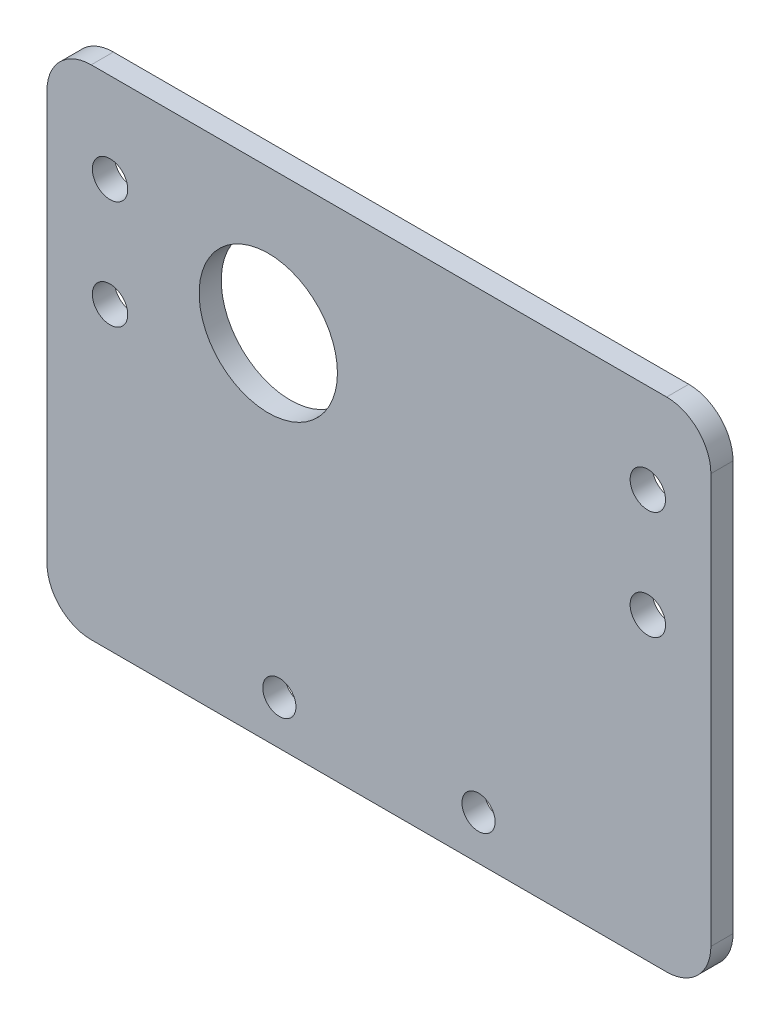
ISO-10303-21;
HEADER;
FILE_DESCRIPTION(('STEP AP214'),'2;1');
FILE_NAME('part.step','',(''),(''),'','','');
FILE_SCHEMA(('AUTOMOTIVE_DESIGN { 1 0 10303 214 1 1 1 1 }'));
ENDSEC;
DATA;
#1=APPLICATION_CONTEXT('core data for automotive mechanical design processes');
#2=APPLICATION_PROTOCOL_DEFINITION('international standard','automotive_design',2000,#1);
#3=PRODUCT_CONTEXT('',#1,'mechanical');
#4=PRODUCT('Part','Part','',(#3));
#5=PRODUCT_RELATED_PRODUCT_CATEGORY('part','',(#4));
#6=PRODUCT_DEFINITION_FORMATION('','',#4);
#7=PRODUCT_DEFINITION_CONTEXT('part definition',#1,'design');
#8=PRODUCT_DEFINITION('design','',#6,#7);
#9=PRODUCT_DEFINITION_SHAPE('','',#8);
#10=(LENGTH_UNIT() NAMED_UNIT(*) SI_UNIT(.MILLI.,.METRE.));
#11=(NAMED_UNIT(*) PLANE_ANGLE_UNIT() SI_UNIT($,.RADIAN.));
#12=(NAMED_UNIT(*) SI_UNIT($,.STERADIAN.) SOLID_ANGLE_UNIT());
#13=UNCERTAINTY_MEASURE_WITH_UNIT(LENGTH_MEASURE(1.E-05),#10,'distance_accuracy_value','');
#14=(GEOMETRIC_REPRESENTATION_CONTEXT(3) GLOBAL_UNCERTAINTY_ASSIGNED_CONTEXT((#13)) GLOBAL_UNIT_ASSIGNED_CONTEXT((#10,
#11,#12)) REPRESENTATION_CONTEXT('',''));
#15=CARTESIAN_POINT('',(0.,0.,0.));
#16=DIRECTION('',(0.,0.,1.));
#17=DIRECTION('',(1.,0.,0.));
#18=AXIS2_PLACEMENT_3D('',#15,#16,#17);
#19=CARTESIAN_POINT('',(0.,0.,2.));
#20=DIRECTION('',(1.,0.,0.));
#21=DIRECTION('',(0.,0.,-1.));
#22=AXIS2_PLACEMENT_3D('',#19,#20,#21);
#23=PLANE('',#22);
#24=DIRECTION('',(0.,-1.,0.));
#25=VECTOR('',#24,1.);
#26=CARTESIAN_POINT('',(0.,0.,0.));
#27=LINE('',#26,#25);
#28=CARTESIAN_POINT('',(0.,41.,0.));
#29=VERTEX_POINT('',#28);
#30=CARTESIAN_POINT('',(0.,4.,0.));
#31=VERTEX_POINT('',#30);
#32=EDGE_CURVE('E159',#29,#31,#27,.T.);
#33=ORIENTED_EDGE('',*,*,#32,.T.);
#34=DIRECTION('',(0.,0.,-1.));
#35=VECTOR('',#34,1.);
#36=CARTESIAN_POINT('',(0.,4.,2.));
#37=LINE('',#36,#35);
#38=CARTESIAN_POINT('',(0.,4.,2.));
#39=VERTEX_POINT('',#38);
#40=EDGE_CURVE('E11',#31,#39,#37,.F.);
#41=ORIENTED_EDGE('',*,*,#40,.T.);
#42=DIRECTION('',(0.,-1.,0.));
#43=VECTOR('',#42,1.);
#44=CARTESIAN_POINT('',(0.,0.,2.));
#45=LINE('',#44,#43);
#46=CARTESIAN_POINT('',(0.,41.,2.));
#47=VERTEX_POINT('',#46);
#48=EDGE_CURVE('E127',#47,#39,#45,.T.);
#49=ORIENTED_EDGE('',*,*,#48,.F.);
#50=DIRECTION('',(0.,0.,-1.));
#51=VECTOR('',#50,1.);
#52=CARTESIAN_POINT('',(0.,41.,2.));
#53=LINE('',#52,#51);
#54=EDGE_CURVE('E43',#47,#29,#53,.T.);
#55=ORIENTED_EDGE('',*,*,#54,.T.);
#56=EDGE_LOOP('',(#33,#41,#49,#55));
#57=FACE_BOUND('',#56,.T.);
#58=ADVANCED_FACE('F35',(#57),#23,.F.);
#59=CARTESIAN_POINT('',(0.,0.,2.));
#60=DIRECTION('',(0.,1.,0.));
#61=DIRECTION('',(0.,0.,1.));
#62=AXIS2_PLACEMENT_3D('',#59,#60,#61);
#63=PLANE('',#62);
#64=DIRECTION('',(1.,0.,0.));
#65=VECTOR('',#64,1.);
#66=CARTESIAN_POINT('',(0.,0.,0.));
#67=LINE('',#66,#65);
#68=CARTESIAN_POINT('',(4.,0.,0.));
#69=VERTEX_POINT('',#68);
#70=CARTESIAN_POINT('',(56.,0.,0.));
#71=VERTEX_POINT('',#70);
#72=EDGE_CURVE('E132',#69,#71,#67,.T.);
#73=ORIENTED_EDGE('',*,*,#72,.T.);
#74=DIRECTION('',(0.,0.,-1.));
#75=VECTOR('',#74,1.);
#76=CARTESIAN_POINT('',(56.,0.,2.));
#77=LINE('',#76,#75);
#78=CARTESIAN_POINT('',(56.,0.,2.));
#79=VERTEX_POINT('',#78);
#80=EDGE_CURVE('E50',#71,#79,#77,.F.);
#81=ORIENTED_EDGE('',*,*,#80,.T.);
#82=DIRECTION('',(1.,0.,0.));
#83=VECTOR('',#82,1.);
#84=CARTESIAN_POINT('',(0.,0.,2.));
#85=LINE('',#84,#83);
#86=CARTESIAN_POINT('',(4.,0.,2.));
#87=VERTEX_POINT('',#86);
#88=EDGE_CURVE('E130',#87,#79,#85,.T.);
#89=ORIENTED_EDGE('',*,*,#88,.F.);
#90=DIRECTION('',(0.,0.,-1.));
#91=VECTOR('',#90,1.);
#92=CARTESIAN_POINT('',(4.,0.,2.));
#93=LINE('',#92,#91);
#94=EDGE_CURVE('E151',#87,#69,#93,.T.);
#95=ORIENTED_EDGE('',*,*,#94,.T.);
#96=EDGE_LOOP('',(#73,#81,#89,#95));
#97=FACE_BOUND('',#96,.T.);
#98=ADVANCED_FACE('F245',(#97),#63,.F.);
#99=CARTESIAN_POINT('',(60.,0.,2.));
#100=DIRECTION('',(-1.,0.,0.));
#101=DIRECTION('',(0.,0.,1.));
#102=AXIS2_PLACEMENT_3D('',#99,#100,#101);
#103=PLANE('',#102);
#104=DIRECTION('',(0.,1.,0.));
#105=VECTOR('',#104,1.);
#106=CARTESIAN_POINT('',(60.,0.,0.));
#107=LINE('',#106,#105);
#108=CARTESIAN_POINT('',(60.,4.,0.));
#109=VERTEX_POINT('',#108);
#110=CARTESIAN_POINT('',(60.,41.,0.));
#111=VERTEX_POINT('',#110);
#112=EDGE_CURVE('E128',#109,#111,#107,.T.);
#113=ORIENTED_EDGE('',*,*,#112,.T.);
#114=DIRECTION('',(0.,0.,-1.));
#115=VECTOR('',#114,1.);
#116=CARTESIAN_POINT('',(60.,41.,2.));
#117=LINE('',#116,#115);
#118=CARTESIAN_POINT('',(60.,41.,2.));
#119=VERTEX_POINT('',#118);
#120=EDGE_CURVE('E106',#111,#119,#117,.F.);
#121=ORIENTED_EDGE('',*,*,#120,.T.);
#122=DIRECTION('',(0.,1.,0.));
#123=VECTOR('',#122,1.);
#124=CARTESIAN_POINT('',(60.,0.,2.));
#125=LINE('',#124,#123);
#126=CARTESIAN_POINT('',(60.,4.,2.));
#127=VERTEX_POINT('',#126);
#128=EDGE_CURVE('E171',#127,#119,#125,.T.);
#129=ORIENTED_EDGE('',*,*,#128,.F.);
#130=DIRECTION('',(0.,0.,-1.));
#131=VECTOR('',#130,1.);
#132=CARTESIAN_POINT('',(60.,4.,2.));
#133=LINE('',#132,#131);
#134=EDGE_CURVE('E111',#127,#109,#133,.T.);
#135=ORIENTED_EDGE('',*,*,#134,.T.);
#136=EDGE_LOOP('',(#113,#121,#129,#135));
#137=FACE_BOUND('',#136,.T.);
#138=ADVANCED_FACE('F242',(#137),#103,.F.);
#139=CARTESIAN_POINT('',(0.,45.,2.));
#140=DIRECTION('',(0.,-1.,0.));
#141=DIRECTION('',(0.,0.,-1.));
#142=AXIS2_PLACEMENT_3D('',#139,#140,#141);
#143=PLANE('',#142);
#144=DIRECTION('',(-1.,0.,0.));
#145=VECTOR('',#144,1.);
#146=CARTESIAN_POINT('',(0.,45.,2.));
#147=LINE('',#146,#145);
#148=CARTESIAN_POINT('',(56.,45.,2.));
#149=VERTEX_POINT('',#148);
#150=CARTESIAN_POINT('',(4.,45.,2.));
#151=VERTEX_POINT('',#150);
#152=EDGE_CURVE('E121',#149,#151,#147,.T.);
#153=ORIENTED_EDGE('',*,*,#152,.F.);
#154=DIRECTION('',(0.,0.,-1.));
#155=VECTOR('',#154,1.);
#156=CARTESIAN_POINT('',(56.,45.,2.));
#157=LINE('',#156,#155);
#158=CARTESIAN_POINT('',(56.,45.,0.));
#159=VERTEX_POINT('',#158);
#160=EDGE_CURVE('E105',#149,#159,#157,.T.);
#161=ORIENTED_EDGE('',*,*,#160,.T.);
#162=DIRECTION('',(-1.,0.,0.));
#163=VECTOR('',#162,1.);
#164=CARTESIAN_POINT('',(0.,45.,0.));
#165=LINE('',#164,#163);
#166=CARTESIAN_POINT('',(4.,45.,0.));
#167=VERTEX_POINT('',#166);
#168=EDGE_CURVE('E118',#159,#167,#165,.T.);
#169=ORIENTED_EDGE('',*,*,#168,.T.);
#170=DIRECTION('',(0.,0.,-1.));
#171=VECTOR('',#170,1.);
#172=CARTESIAN_POINT('',(4.,45.,2.));
#173=LINE('',#172,#171);
#174=EDGE_CURVE('E123',#167,#151,#173,.F.);
#175=ORIENTED_EDGE('',*,*,#174,.T.);
#176=EDGE_LOOP('',(#153,#161,#169,#175));
#177=FACE_BOUND('',#176,.T.);
#178=ADVANCED_FACE('F117',(#177),#143,.F.);
#179=CARTESIAN_POINT('',(0.,0.,2.));
#180=DIRECTION('',(0.,0.,-1.));
#181=DIRECTION('',(-1.,0.,0.));
#182=AXIS2_PLACEMENT_3D('',#179,#180,#181);
#183=PLANE('',#182);
#184=CARTESIAN_POINT('',(20.,32.,2.));
#185=DIRECTION('',(0.,0.,1.));
#186=DIRECTION('',(1.,0.,0.));
#187=AXIS2_PLACEMENT_3D('',#184,#185,#186);
#188=CIRCLE('',#187,6.25);
#189=CARTESIAN_POINT('',(26.25,32.,2.));
#190=VERTEX_POINT('',#189);
#191=EDGE_CURVE('E208',#190,#190,#188,.T.);
#192=ORIENTED_EDGE('',*,*,#191,.F.);
#193=EDGE_LOOP('',(#192));
#194=FACE_BOUND('',#193,.T.);
#195=CARTESIAN_POINT('',(5.7,27.1,2.));
#196=DIRECTION('',(0.,0.,1.));
#197=DIRECTION('',(1.,0.,0.));
#198=AXIS2_PLACEMENT_3D('',#195,#196,#197);
#199=CIRCLE('',#198,1.6);
#200=CARTESIAN_POINT('',(7.3,27.1,2.));
#201=VERTEX_POINT('',#200);
#202=EDGE_CURVE('E197',#201,#201,#199,.T.);
#203=ORIENTED_EDGE('',*,*,#202,.F.);
#204=EDGE_LOOP('',(#203));
#205=FACE_BOUND('',#204,.T.);
#206=CARTESIAN_POINT('',(54.3,36.9,2.));
#207=DIRECTION('',(0.,0.,1.));
#208=DIRECTION('',(1.,0.,0.));
#209=AXIS2_PLACEMENT_3D('',#206,#207,#208);
#210=CIRCLE('',#209,1.6);
#211=CARTESIAN_POINT('',(55.9,36.9,2.));
#212=VERTEX_POINT('',#211);
#213=EDGE_CURVE('E190',#212,#212,#210,.T.);
#214=ORIENTED_EDGE('',*,*,#213,.F.);
#215=EDGE_LOOP('',(#214));
#216=FACE_BOUND('',#215,.T.);
#217=CARTESIAN_POINT('',(54.3,27.1,2.));
#218=DIRECTION('',(0.,0.,1.));
#219=DIRECTION('',(1.,0.,0.));
#220=AXIS2_PLACEMENT_3D('',#217,#218,#219);
#221=CIRCLE('',#220,1.6);
#222=CARTESIAN_POINT('',(55.9,27.1,2.));
#223=VERTEX_POINT('',#222);
#224=EDGE_CURVE('E202',#223,#223,#221,.T.);
#225=ORIENTED_EDGE('',*,*,#224,.F.);
#226=EDGE_LOOP('',(#225));
#227=FACE_BOUND('',#226,.T.);
#228=CARTESIAN_POINT('',(5.7,36.9,2.));
#229=DIRECTION('',(0.,0.,1.));
#230=DIRECTION('',(1.,0.,0.));
#231=AXIS2_PLACEMENT_3D('',#228,#229,#230);
#232=CIRCLE('',#231,1.6);
#233=CARTESIAN_POINT('',(7.29999999999999,36.9,2.));
#234=VERTEX_POINT('',#233);
#235=EDGE_CURVE('E184',#234,#234,#232,.T.);
#236=ORIENTED_EDGE('',*,*,#235,.F.);
#237=EDGE_LOOP('',(#236));
#238=FACE_BOUND('',#237,.T.);
#239=CARTESIAN_POINT('',(39.,3.99999999999999,2.));
#240=DIRECTION('',(0.,0.,-1.));
#241=DIRECTION('',(-1.,0.,0.));
#242=AXIS2_PLACEMENT_3D('',#239,#240,#241);
#243=CIRCLE('',#242,1.5);
#244=CARTESIAN_POINT('',(37.5,3.99999999999999,2.));
#245=VERTEX_POINT('',#244);
#246=EDGE_CURVE('E164',#245,#245,#243,.T.);
#247=ORIENTED_EDGE('',*,*,#246,.T.);
#248=EDGE_LOOP('',(#247));
#249=FACE_BOUND('',#248,.T.);
#250=CARTESIAN_POINT('',(21.,3.99999999999999,2.));
#251=DIRECTION('',(0.,0.,-1.));
#252=DIRECTION('',(-1.,0.,0.));
#253=AXIS2_PLACEMENT_3D('',#250,#251,#252);
#254=CIRCLE('',#253,1.5);
#255=CARTESIAN_POINT('',(19.5,3.99999999999999,2.));
#256=VERTEX_POINT('',#255);
#257=EDGE_CURVE('E178',#256,#256,#254,.T.);
#258=ORIENTED_EDGE('',*,*,#257,.T.);
#259=EDGE_LOOP('',(#258));
#260=FACE_BOUND('',#259,.T.);
#261=ORIENTED_EDGE('',*,*,#128,.T.);
#262=CARTESIAN_POINT('',(56.,41.,2.));
#263=DIRECTION('',(0.,0.,-1.));
#264=DIRECTION('',(-1.,0.,0.));
#265=AXIS2_PLACEMENT_3D('',#262,#263,#264);
#266=CIRCLE('',#265,4.);
#267=EDGE_CURVE('E149',#119,#149,#266,.F.);
#268=ORIENTED_EDGE('',*,*,#267,.T.);
#269=ORIENTED_EDGE('',*,*,#152,.T.);
#270=CARTESIAN_POINT('',(4.,41.,2.));
#271=DIRECTION('',(0.,0.,-1.));
#272=DIRECTION('',(-1.,0.,0.));
#273=AXIS2_PLACEMENT_3D('',#270,#271,#272);
#274=CIRCLE('',#273,4.);
#275=EDGE_CURVE('E144',#151,#47,#274,.F.);
#276=ORIENTED_EDGE('',*,*,#275,.T.);
#277=ORIENTED_EDGE('',*,*,#48,.T.);
#278=CARTESIAN_POINT('',(4.,4.,2.));
#279=DIRECTION('',(0.,0.,-1.));
#280=DIRECTION('',(-1.,0.,0.));
#281=AXIS2_PLACEMENT_3D('',#278,#279,#280);
#282=CIRCLE('',#281,4.);
#283=EDGE_CURVE('E57',#39,#87,#282,.F.);
#284=ORIENTED_EDGE('',*,*,#283,.T.);
#285=ORIENTED_EDGE('',*,*,#88,.T.);
#286=CARTESIAN_POINT('',(56.,4.,2.));
#287=DIRECTION('',(0.,0.,-1.));
#288=DIRECTION('',(-1.,0.,0.));
#289=AXIS2_PLACEMENT_3D('',#286,#287,#288);
#290=CIRCLE('',#289,4.);
#291=EDGE_CURVE('E147',#79,#127,#290,.F.);
#292=ORIENTED_EDGE('',*,*,#291,.T.);
#293=EDGE_LOOP('',(#261,#268,#269,#276,#277,#284,#285,#292));
#294=FACE_BOUND('',#293,.T.);
#295=ADVANCED_FACE('F223',(#194,#205,#216,#227,#238,#249,#260,#294),#183,.F.);
#296=CARTESIAN_POINT('',(0.,0.,0.));
#297=DIRECTION('',(0.,0.,-1.));
#298=DIRECTION('',(-1.,0.,0.));
#299=AXIS2_PLACEMENT_3D('',#296,#297,#298);
#300=PLANE('',#299);
#301=CARTESIAN_POINT('',(20.,32.,0.));
#302=DIRECTION('',(0.,0.,1.));
#303=DIRECTION('',(1.,0.,0.));
#304=AXIS2_PLACEMENT_3D('',#301,#302,#303);
#305=CIRCLE('',#304,6.25);
#306=CARTESIAN_POINT('',(26.25,32.,0.));
#307=VERTEX_POINT('',#306);
#308=EDGE_CURVE('E205',#307,#307,#305,.T.);
#309=ORIENTED_EDGE('',*,*,#308,.T.);
#310=EDGE_LOOP('',(#309));
#311=FACE_BOUND('',#310,.T.);
#312=CARTESIAN_POINT('',(5.7,27.1,0.));
#313=DIRECTION('',(0.,0.,1.));
#314=DIRECTION('',(1.,0.,0.));
#315=AXIS2_PLACEMENT_3D('',#312,#313,#314);
#316=CIRCLE('',#315,1.6);
#317=CARTESIAN_POINT('',(7.3,27.1,0.));
#318=VERTEX_POINT('',#317);
#319=EDGE_CURVE('E187',#318,#318,#316,.T.);
#320=ORIENTED_EDGE('',*,*,#319,.T.);
#321=EDGE_LOOP('',(#320));
#322=FACE_BOUND('',#321,.T.);
#323=CARTESIAN_POINT('',(54.3,36.9,0.));
#324=DIRECTION('',(0.,0.,1.));
#325=DIRECTION('',(1.,0.,0.));
#326=AXIS2_PLACEMENT_3D('',#323,#324,#325);
#327=CIRCLE('',#326,1.6);
#328=CARTESIAN_POINT('',(55.9,36.9,0.));
#329=VERTEX_POINT('',#328);
#330=EDGE_CURVE('E193',#329,#329,#327,.T.);
#331=ORIENTED_EDGE('',*,*,#330,.T.);
#332=EDGE_LOOP('',(#331));
#333=FACE_BOUND('',#332,.T.);
#334=CARTESIAN_POINT('',(54.3,27.1,0.));
#335=DIRECTION('',(0.,0.,1.));
#336=DIRECTION('',(1.,0.,0.));
#337=AXIS2_PLACEMENT_3D('',#334,#335,#336);
#338=CIRCLE('',#337,1.6);
#339=CARTESIAN_POINT('',(55.9,27.1,0.));
#340=VERTEX_POINT('',#339);
#341=EDGE_CURVE('E194',#340,#340,#338,.T.);
#342=ORIENTED_EDGE('',*,*,#341,.T.);
#343=EDGE_LOOP('',(#342));
#344=FACE_BOUND('',#343,.T.);
#345=CARTESIAN_POINT('',(5.7,36.9,0.));
#346=DIRECTION('',(0.,0.,1.));
#347=DIRECTION('',(1.,0.,0.));
#348=AXIS2_PLACEMENT_3D('',#345,#346,#347);
#349=CIRCLE('',#348,1.6);
#350=CARTESIAN_POINT('',(7.29999999999999,36.9,0.));
#351=VERTEX_POINT('',#350);
#352=EDGE_CURVE('E179',#351,#351,#349,.T.);
#353=ORIENTED_EDGE('',*,*,#352,.T.);
#354=EDGE_LOOP('',(#353));
#355=FACE_BOUND('',#354,.T.);
#356=CARTESIAN_POINT('',(39.,3.99999999999999,0.));
#357=DIRECTION('',(0.,0.,-1.));
#358=DIRECTION('',(-1.,0.,0.));
#359=AXIS2_PLACEMENT_3D('',#356,#357,#358);
#360=CIRCLE('',#359,1.5);
#361=CARTESIAN_POINT('',(37.5,3.99999999999999,0.));
#362=VERTEX_POINT('',#361);
#363=EDGE_CURVE('E167',#362,#362,#360,.T.);
#364=ORIENTED_EDGE('',*,*,#363,.F.);
#365=EDGE_LOOP('',(#364));
#366=FACE_BOUND('',#365,.T.);
#367=CARTESIAN_POINT('',(21.,3.99999999999999,0.));
#368=DIRECTION('',(0.,0.,-1.));
#369=DIRECTION('',(-1.,0.,0.));
#370=AXIS2_PLACEMENT_3D('',#367,#368,#369);
#371=CIRCLE('',#370,1.5);
#372=CARTESIAN_POINT('',(19.5,3.99999999999999,0.));
#373=VERTEX_POINT('',#372);
#374=EDGE_CURVE('E175',#373,#373,#371,.T.);
#375=ORIENTED_EDGE('',*,*,#374,.F.);
#376=EDGE_LOOP('',(#375));
#377=FACE_BOUND('',#376,.T.);
#378=ORIENTED_EDGE('',*,*,#168,.F.);
#379=CARTESIAN_POINT('',(56.,41.,0.));
#380=DIRECTION('',(0.,0.,-1.));
#381=DIRECTION('',(-1.,0.,0.));
#382=AXIS2_PLACEMENT_3D('',#379,#380,#381);
#383=CIRCLE('',#382,4.);
#384=EDGE_CURVE('E101',#159,#111,#383,.T.);
#385=ORIENTED_EDGE('',*,*,#384,.T.);
#386=ORIENTED_EDGE('',*,*,#112,.F.);
#387=CARTESIAN_POINT('',(56.,4.,0.));
#388=DIRECTION('',(0.,0.,-1.));
#389=DIRECTION('',(-1.,0.,0.));
#390=AXIS2_PLACEMENT_3D('',#387,#388,#389);
#391=CIRCLE('',#390,4.);
#392=EDGE_CURVE('E112',#109,#71,#391,.T.);
#393=ORIENTED_EDGE('',*,*,#392,.T.);
#394=ORIENTED_EDGE('',*,*,#72,.F.);
#395=CARTESIAN_POINT('',(4.,4.,0.));
#396=DIRECTION('',(0.,0.,-1.));
#397=DIRECTION('',(-1.,0.,0.));
#398=AXIS2_PLACEMENT_3D('',#395,#396,#397);
#399=CIRCLE('',#398,4.);
#400=EDGE_CURVE('E138',#69,#31,#399,.T.);
#401=ORIENTED_EDGE('',*,*,#400,.T.);
#402=ORIENTED_EDGE('',*,*,#32,.F.);
#403=CARTESIAN_POINT('',(4.,41.,0.));
#404=DIRECTION('',(0.,0.,-1.));
#405=DIRECTION('',(-1.,0.,0.));
#406=AXIS2_PLACEMENT_3D('',#403,#404,#405);
#407=CIRCLE('',#406,4.);
#408=EDGE_CURVE('E122',#29,#167,#407,.T.);
#409=ORIENTED_EDGE('',*,*,#408,.T.);
#410=EDGE_LOOP('',(#378,#385,#386,#393,#394,#401,#402,#409));
#411=FACE_BOUND('',#410,.T.);
#412=ADVANCED_FACE('F125',(#311,#322,#333,#344,#355,#366,#377,#411),#300,.T.);
#413=CARTESIAN_POINT('',(56.,41.,2.));
#414=DIRECTION('',(0.,0.,-1.));
#415=DIRECTION('',(-1.,0.,0.));
#416=AXIS2_PLACEMENT_3D('',#413,#414,#415);
#417=CYLINDRICAL_SURFACE('',#416,4.);
#418=ORIENTED_EDGE('',*,*,#267,.F.);
#419=ORIENTED_EDGE('',*,*,#120,.F.);
#420=ORIENTED_EDGE('',*,*,#384,.F.);
#421=ORIENTED_EDGE('',*,*,#160,.F.);
#422=EDGE_LOOP('',(#418,#419,#420,#421));
#423=FACE_BOUND('',#422,.T.);
#424=ADVANCED_FACE('F104',(#423),#417,.T.);
#425=CARTESIAN_POINT('',(56.,4.,2.));
#426=DIRECTION('',(0.,0.,-1.));
#427=DIRECTION('',(-1.,0.,0.));
#428=AXIS2_PLACEMENT_3D('',#425,#426,#427);
#429=CYLINDRICAL_SURFACE('',#428,4.);
#430=ORIENTED_EDGE('',*,*,#291,.F.);
#431=ORIENTED_EDGE('',*,*,#80,.F.);
#432=ORIENTED_EDGE('',*,*,#392,.F.);
#433=ORIENTED_EDGE('',*,*,#134,.F.);
#434=EDGE_LOOP('',(#430,#431,#432,#433));
#435=FACE_BOUND('',#434,.T.);
#436=ADVANCED_FACE('F244',(#435),#429,.T.);
#437=CARTESIAN_POINT('',(4.,4.,2.));
#438=DIRECTION('',(0.,0.,-1.));
#439=DIRECTION('',(-1.,0.,0.));
#440=AXIS2_PLACEMENT_3D('',#437,#438,#439);
#441=CYLINDRICAL_SURFACE('',#440,4.);
#442=ORIENTED_EDGE('',*,*,#283,.F.);
#443=ORIENTED_EDGE('',*,*,#40,.F.);
#444=ORIENTED_EDGE('',*,*,#400,.F.);
#445=ORIENTED_EDGE('',*,*,#94,.F.);
#446=EDGE_LOOP('',(#442,#443,#444,#445));
#447=FACE_BOUND('',#446,.T.);
#448=ADVANCED_FACE('F248',(#447),#441,.T.);
#449=CARTESIAN_POINT('',(4.,41.,2.));
#450=DIRECTION('',(0.,0.,-1.));
#451=DIRECTION('',(-1.,0.,0.));
#452=AXIS2_PLACEMENT_3D('',#449,#450,#451);
#453=CYLINDRICAL_SURFACE('',#452,4.);
#454=ORIENTED_EDGE('',*,*,#275,.F.);
#455=ORIENTED_EDGE('',*,*,#174,.F.);
#456=ORIENTED_EDGE('',*,*,#408,.F.);
#457=ORIENTED_EDGE('',*,*,#54,.F.);
#458=EDGE_LOOP('',(#454,#455,#456,#457));
#459=FACE_BOUND('',#458,.T.);
#460=ADVANCED_FACE('F37',(#459),#453,.T.);
#461=CARTESIAN_POINT('',(21.,3.99999999999999,2.));
#462=DIRECTION('',(0.,0.,-1.));
#463=DIRECTION('',(-1.,0.,0.));
#464=AXIS2_PLACEMENT_3D('',#461,#462,#463);
#465=CYLINDRICAL_SURFACE('',#464,1.5);
#466=ORIENTED_EDGE('',*,*,#257,.F.);
#467=EDGE_LOOP('',(#466));
#468=FACE_BOUND('',#467,.T.);
#469=ORIENTED_EDGE('',*,*,#374,.T.);
#470=EDGE_LOOP('',(#469));
#471=FACE_BOUND('',#470,.T.);
#472=ADVANCED_FACE('F250',(#468,#471),#465,.F.);
#473=CARTESIAN_POINT('',(39.,3.99999999999999,2.));
#474=DIRECTION('',(0.,0.,-1.));
#475=DIRECTION('',(-1.,0.,0.));
#476=AXIS2_PLACEMENT_3D('',#473,#474,#475);
#477=CYLINDRICAL_SURFACE('',#476,1.5);
#478=ORIENTED_EDGE('',*,*,#246,.F.);
#479=EDGE_LOOP('',(#478));
#480=FACE_BOUND('',#479,.T.);
#481=ORIENTED_EDGE('',*,*,#363,.T.);
#482=EDGE_LOOP('',(#481));
#483=FACE_BOUND('',#482,.T.);
#484=ADVANCED_FACE('F255',(#480,#483),#477,.F.);
#485=CARTESIAN_POINT('',(5.7,36.9,0.));
#486=DIRECTION('',(0.,0.,1.));
#487=DIRECTION('',(1.,0.,0.));
#488=AXIS2_PLACEMENT_3D('',#485,#486,#487);
#489=CYLINDRICAL_SURFACE('',#488,1.6);
#490=ORIENTED_EDGE('',*,*,#352,.F.);
#491=EDGE_LOOP('',(#490));
#492=FACE_BOUND('',#491,.T.);
#493=ORIENTED_EDGE('',*,*,#235,.T.);
#494=EDGE_LOOP('',(#493));
#495=FACE_BOUND('',#494,.T.);
#496=ADVANCED_FACE('F297',(#492,#495),#489,.F.);
#497=CARTESIAN_POINT('',(54.3,27.1,0.));
#498=DIRECTION('',(0.,0.,1.));
#499=DIRECTION('',(1.,0.,0.));
#500=AXIS2_PLACEMENT_3D('',#497,#498,#499);
#501=CYLINDRICAL_SURFACE('',#500,1.6);
#502=ORIENTED_EDGE('',*,*,#341,.F.);
#503=EDGE_LOOP('',(#502));
#504=FACE_BOUND('',#503,.T.);
#505=ORIENTED_EDGE('',*,*,#224,.T.);
#506=EDGE_LOOP('',(#505));
#507=FACE_BOUND('',#506,.T.);
#508=ADVANCED_FACE('F307',(#504,#507),#501,.F.);
#509=CARTESIAN_POINT('',(54.3,36.9,0.));
#510=DIRECTION('',(0.,0.,1.));
#511=DIRECTION('',(1.,0.,0.));
#512=AXIS2_PLACEMENT_3D('',#509,#510,#511);
#513=CYLINDRICAL_SURFACE('',#512,1.6);
#514=ORIENTED_EDGE('',*,*,#330,.F.);
#515=EDGE_LOOP('',(#514));
#516=FACE_BOUND('',#515,.T.);
#517=ORIENTED_EDGE('',*,*,#213,.T.);
#518=EDGE_LOOP('',(#517));
#519=FACE_BOUND('',#518,.T.);
#520=ADVANCED_FACE('F317',(#516,#519),#513,.F.);
#521=CARTESIAN_POINT('',(5.7,27.1,0.));
#522=DIRECTION('',(0.,0.,1.));
#523=DIRECTION('',(1.,0.,0.));
#524=AXIS2_PLACEMENT_3D('',#521,#522,#523);
#525=CYLINDRICAL_SURFACE('',#524,1.6);
#526=ORIENTED_EDGE('',*,*,#319,.F.);
#527=EDGE_LOOP('',(#526));
#528=FACE_BOUND('',#527,.T.);
#529=ORIENTED_EDGE('',*,*,#202,.T.);
#530=EDGE_LOOP('',(#529));
#531=FACE_BOUND('',#530,.T.);
#532=ADVANCED_FACE('F219',(#528,#531),#525,.F.);
#533=CARTESIAN_POINT('',(20.,32.,0.));
#534=DIRECTION('',(0.,0.,1.));
#535=DIRECTION('',(1.,0.,0.));
#536=AXIS2_PLACEMENT_3D('',#533,#534,#535);
#537=CYLINDRICAL_SURFACE('',#536,6.25);
#538=ORIENTED_EDGE('',*,*,#308,.F.);
#539=EDGE_LOOP('',(#538));
#540=FACE_BOUND('',#539,.T.);
#541=ORIENTED_EDGE('',*,*,#191,.T.);
#542=EDGE_LOOP('',(#541));
#543=FACE_BOUND('',#542,.T.);
#544=ADVANCED_FACE('F216',(#540,#543),#537,.F.);
#545=CLOSED_SHELL('',(#58,#98,#138,#178,#295,#412,#424,#436,#448,#460,#472,#484,#496,#508,#520,
#532,#544));
#546=MANIFOLD_SOLID_BREP('B2',#545);
#547=ADVANCED_BREP_SHAPE_REPRESENTATION('',(#18,#546),#14);
#548=SHAPE_DEFINITION_REPRESENTATION(#9,#547);
ENDSEC;
END-ISO-10303-21;
